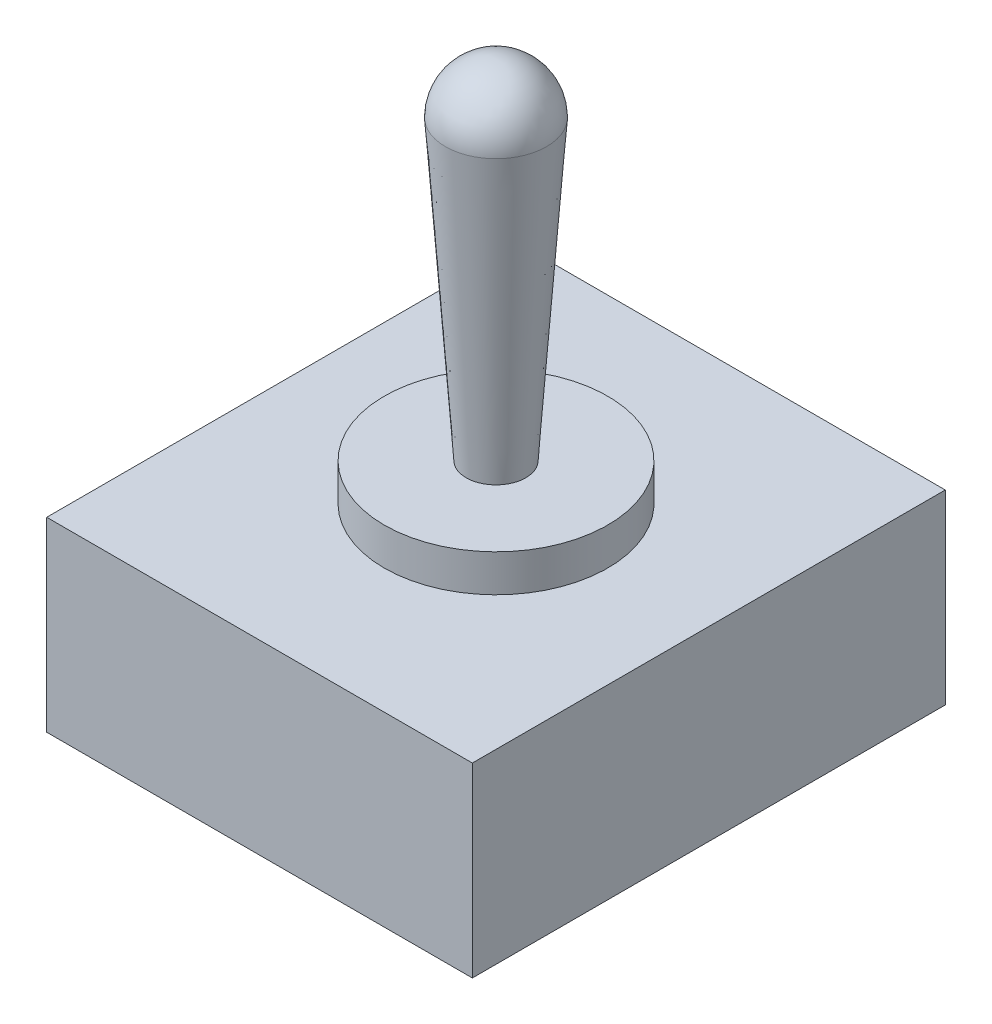
ISO-10303-21;
HEADER;
FILE_DESCRIPTION(('STEP AP214'),'2;1');
FILE_NAME('part.step','',(''),(''),'','','');
FILE_SCHEMA(('AUTOMOTIVE_DESIGN { 1 0 10303 214 1 1 1 1 }'));
ENDSEC;
DATA;
#1=APPLICATION_CONTEXT('core data for automotive mechanical design processes');
#2=APPLICATION_PROTOCOL_DEFINITION('international standard','automotive_design',2000,#1);
#3=PRODUCT_CONTEXT('',#1,'mechanical');
#4=PRODUCT('Part','Part','',(#3));
#5=PRODUCT_RELATED_PRODUCT_CATEGORY('part','',(#4));
#6=PRODUCT_DEFINITION_FORMATION('','',#4);
#7=PRODUCT_DEFINITION_CONTEXT('part definition',#1,'design');
#8=PRODUCT_DEFINITION('design','',#6,#7);
#9=PRODUCT_DEFINITION_SHAPE('','',#8);
#10=(LENGTH_UNIT() NAMED_UNIT(*) SI_UNIT(.MILLI.,.METRE.));
#11=(NAMED_UNIT(*) PLANE_ANGLE_UNIT() SI_UNIT($,.RADIAN.));
#12=(NAMED_UNIT(*) SI_UNIT($,.STERADIAN.) SOLID_ANGLE_UNIT());
#13=UNCERTAINTY_MEASURE_WITH_UNIT(LENGTH_MEASURE(1.E-05),#10,'distance_accuracy_value','');
#14=(GEOMETRIC_REPRESENTATION_CONTEXT(3) GLOBAL_UNCERTAINTY_ASSIGNED_CONTEXT((#13)) GLOBAL_UNIT_ASSIGNED_CONTEXT((#10,
#11,#12)) REPRESENTATION_CONTEXT('',''));
#15=CARTESIAN_POINT('',(0.,0.,0.));
#16=DIRECTION('',(0.,0.,1.));
#17=DIRECTION('',(1.,0.,0.));
#18=AXIS2_PLACEMENT_3D('',#15,#16,#17);
#19=CARTESIAN_POINT('',(5.715,13.9805124020786,-6.35));
#20=DIRECTION('',(0.,-1.,0.));
#21=DIRECTION('',(0.,0.,1.));
#22=AXIS2_PLACEMENT_3D('',#19,#20,#21);
#23=SPHERICAL_SURFACE('',#22,1.35805178995303);
#24=CARTESIAN_POINT('',(5.715,13.9805124020786,-6.35));
#25=DIRECTION('',(0.,-1.,0.));
#26=DIRECTION('',(0.,0.,-1.));
#27=AXIS2_PLACEMENT_3D('',#24,#25,#26);
#28=CIRCLE('',#27,1.35805178995303);
#29=CARTESIAN_POINT('',(5.715,13.9805124020786,-7.70805178995303));
#30=VERTEX_POINT('',#29);
#31=EDGE_CURVE('E11',#30,#30,#28,.T.);
#32=ORIENTED_EDGE('',*,*,#31,.F.);
#33=EDGE_LOOP('',(#32));
#34=FACE_BOUND('',#33,.T.);
#35=ADVANCED_FACE('F49',(#34),#23,.T.);
#36=CARTESIAN_POINT('',(5.715,6.,-6.35));
#37=DIRECTION('',(0.,1.,0.));
#38=DIRECTION('',(0.,0.,1.));
#39=AXIS2_PLACEMENT_3D('',#36,#37,#38);
#40=CONICAL_SURFACE('',#39,0.800000000000001,0.0698131700797767);
#41=ORIENTED_EDGE('',*,*,#31,.T.);
#42=EDGE_LOOP('',(#41));
#43=FACE_BOUND('',#42,.T.);
#44=CARTESIAN_POINT('',(5.715,6.,-6.35));
#45=DIRECTION('',(0.,-1.,0.));
#46=DIRECTION('',(0.,0.,-1.));
#47=AXIS2_PLACEMENT_3D('',#44,#45,#46);
#48=CIRCLE('',#47,0.800000000000001);
#49=CARTESIAN_POINT('',(5.715,6.,-7.15));
#50=VERTEX_POINT('',#49);
#51=EDGE_CURVE('E55',#50,#50,#48,.T.);
#52=ORIENTED_EDGE('',*,*,#51,.F.);
#53=EDGE_LOOP('',(#52));
#54=FACE_BOUND('',#53,.T.);
#55=ADVANCED_FACE('F63',(#43,#54),#40,.T.);
#56=CARTESIAN_POINT('',(5.715,6.,-6.35));
#57=DIRECTION('',(0.,-1.,0.));
#58=DIRECTION('',(0.,0.,1.));
#59=AXIS2_PLACEMENT_3D('',#56,#57,#58);
#60=SPHERICAL_SURFACE('',#59,0.800000000000001);
#61=ORIENTED_EDGE('',*,*,#51,.T.);
#62=EDGE_LOOP('',(#61));
#63=FACE_BOUND('',#62,.T.);
#64=ADVANCED_FACE('F61',(#63),#60,.F.);
#65=CLOSED_SHELL('',(#35,#55,#64));
#66=MANIFOLD_SOLID_BREP('B2',#65);
#67=CARTESIAN_POINT('',(0.,5.,0.));
#68=DIRECTION('',(1.,0.,0.));
#69=DIRECTION('',(0.,0.,-1.));
#70=AXIS2_PLACEMENT_3D('',#67,#68,#69);
#71=PLANE('',#70);
#72=DIRECTION('',(0.,0.,1.));
#73=VECTOR('',#72,1.);
#74=CARTESIAN_POINT('',(0.,0.,0.));
#75=LINE('',#74,#73);
#76=CARTESIAN_POINT('',(0.,0.,-12.7));
#77=VERTEX_POINT('',#76);
#78=CARTESIAN_POINT('',(0.,0.,0.));
#79=VERTEX_POINT('',#78);
#80=EDGE_CURVE('E160',#77,#79,#75,.T.);
#81=ORIENTED_EDGE('',*,*,#80,.T.);
#82=DIRECTION('',(0.,-1.,0.));
#83=VECTOR('',#82,1.);
#84=CARTESIAN_POINT('',(0.,5.,0.));
#85=LINE('',#84,#83);
#86=CARTESIAN_POINT('',(0.,5.,0.));
#87=VERTEX_POINT('',#86);
#88=EDGE_CURVE('E97',#87,#79,#85,.T.);
#89=ORIENTED_EDGE('',*,*,#88,.F.);
#90=DIRECTION('',(0.,0.,1.));
#91=VECTOR('',#90,1.);
#92=CARTESIAN_POINT('',(0.,5.,0.));
#93=LINE('',#92,#91);
#94=CARTESIAN_POINT('',(0.,5.,-12.7));
#95=VERTEX_POINT('',#94);
#96=EDGE_CURVE('E147',#95,#87,#93,.T.);
#97=ORIENTED_EDGE('',*,*,#96,.F.);
#98=DIRECTION('',(0.,-1.,0.));
#99=VECTOR('',#98,1.);
#100=CARTESIAN_POINT('',(0.,5.,-12.7));
#101=LINE('',#100,#99);
#102=EDGE_CURVE('E156',#95,#77,#101,.T.);
#103=ORIENTED_EDGE('',*,*,#102,.T.);
#104=EDGE_LOOP('',(#81,#89,#97,#103));
#105=FACE_BOUND('',#104,.T.);
#106=ADVANCED_FACE('F94',(#105),#71,.F.);
#107=CARTESIAN_POINT('',(0.,5.,0.));
#108=DIRECTION('',(0.,0.,-1.));
#109=DIRECTION('',(-1.,0.,0.));
#110=AXIS2_PLACEMENT_3D('',#107,#108,#109);
#111=PLANE('',#110);
#112=DIRECTION('',(1.,0.,0.));
#113=VECTOR('',#112,1.);
#114=CARTESIAN_POINT('',(0.,0.,0.));
#115=LINE('',#114,#113);
#116=CARTESIAN_POINT('',(11.43,0.,0.));
#117=VERTEX_POINT('',#116);
#118=EDGE_CURVE('E152',#79,#117,#115,.T.);
#119=ORIENTED_EDGE('',*,*,#118,.T.);
#120=DIRECTION('',(0.,-1.,0.));
#121=VECTOR('',#120,1.);
#122=CARTESIAN_POINT('',(11.43,5.,0.));
#123=LINE('',#122,#121);
#124=CARTESIAN_POINT('',(11.43,5.,0.));
#125=VERTEX_POINT('',#124);
#126=EDGE_CURVE('E150',#125,#117,#123,.T.);
#127=ORIENTED_EDGE('',*,*,#126,.F.);
#128=DIRECTION('',(1.,0.,0.));
#129=VECTOR('',#128,1.);
#130=CARTESIAN_POINT('',(0.,5.,0.));
#131=LINE('',#130,#129);
#132=EDGE_CURVE('E142',#87,#125,#131,.T.);
#133=ORIENTED_EDGE('',*,*,#132,.F.);
#134=ORIENTED_EDGE('',*,*,#88,.T.);
#135=EDGE_LOOP('',(#119,#127,#133,#134));
#136=FACE_BOUND('',#135,.T.);
#137=ADVANCED_FACE('F151',(#136),#111,.F.);
#138=CARTESIAN_POINT('',(11.43,5.,0.));
#139=DIRECTION('',(-1.,0.,0.));
#140=DIRECTION('',(0.,0.,1.));
#141=AXIS2_PLACEMENT_3D('',#138,#139,#140);
#142=PLANE('',#141);
#143=DIRECTION('',(0.,0.,-1.));
#144=VECTOR('',#143,1.);
#145=CARTESIAN_POINT('',(11.43,0.,0.));
#146=LINE('',#145,#144);
#147=CARTESIAN_POINT('',(11.43,0.,-12.7));
#148=VERTEX_POINT('',#147);
#149=EDGE_CURVE('E128',#117,#148,#146,.T.);
#150=ORIENTED_EDGE('',*,*,#149,.T.);
#151=DIRECTION('',(0.,-1.,0.));
#152=VECTOR('',#151,1.);
#153=CARTESIAN_POINT('',(11.43,5.,-12.7));
#154=LINE('',#153,#152);
#155=CARTESIAN_POINT('',(11.43,5.,-12.7));
#156=VERTEX_POINT('',#155);
#157=EDGE_CURVE('E153',#156,#148,#154,.T.);
#158=ORIENTED_EDGE('',*,*,#157,.F.);
#159=DIRECTION('',(0.,0.,-1.));
#160=VECTOR('',#159,1.);
#161=CARTESIAN_POINT('',(11.43,5.,0.));
#162=LINE('',#161,#160);
#163=EDGE_CURVE('E145',#125,#156,#162,.T.);
#164=ORIENTED_EDGE('',*,*,#163,.F.);
#165=ORIENTED_EDGE('',*,*,#126,.T.);
#166=EDGE_LOOP('',(#150,#158,#164,#165));
#167=FACE_BOUND('',#166,.T.);
#168=ADVANCED_FACE('F154',(#167),#142,.F.);
#169=CARTESIAN_POINT('',(0.,5.,-12.7));
#170=DIRECTION('',(0.,0.,1.));
#171=DIRECTION('',(1.,0.,0.));
#172=AXIS2_PLACEMENT_3D('',#169,#170,#171);
#173=PLANE('',#172);
#174=DIRECTION('',(-1.,0.,0.));
#175=VECTOR('',#174,1.);
#176=CARTESIAN_POINT('',(0.,0.,-12.7));
#177=LINE('',#176,#175);
#178=EDGE_CURVE('E134',#148,#77,#177,.T.);
#179=ORIENTED_EDGE('',*,*,#178,.T.);
#180=ORIENTED_EDGE('',*,*,#102,.F.);
#181=DIRECTION('',(-1.,0.,0.));
#182=VECTOR('',#181,1.);
#183=CARTESIAN_POINT('',(0.,5.,-12.7));
#184=LINE('',#183,#182);
#185=EDGE_CURVE('E111',#156,#95,#184,.T.);
#186=ORIENTED_EDGE('',*,*,#185,.F.);
#187=ORIENTED_EDGE('',*,*,#157,.T.);
#188=EDGE_LOOP('',(#179,#180,#186,#187));
#189=FACE_BOUND('',#188,.T.);
#190=ADVANCED_FACE('F168',(#189),#173,.F.);
#191=CARTESIAN_POINT('',(0.,5.,0.));
#192=DIRECTION('',(0.,-1.,0.));
#193=DIRECTION('',(0.,0.,-1.));
#194=AXIS2_PLACEMENT_3D('',#191,#192,#193);
#195=PLANE('',#194);
#196=CARTESIAN_POINT('',(5.715,5.,-6.35));
#197=DIRECTION('',(0.,1.,0.));
#198=DIRECTION('',(0.,0.,1.));
#199=AXIS2_PLACEMENT_3D('',#196,#197,#198);
#200=CIRCLE('',#199,3.);
#201=CARTESIAN_POINT('',(5.715,5.,-3.35));
#202=VERTEX_POINT('',#201);
#203=EDGE_CURVE('E47',#202,#202,#200,.T.);
#204=ORIENTED_EDGE('',*,*,#203,.F.);
#205=EDGE_LOOP('',(#204));
#206=FACE_BOUND('',#205,.T.);
#207=ORIENTED_EDGE('',*,*,#96,.T.);
#208=ORIENTED_EDGE('',*,*,#132,.T.);
#209=ORIENTED_EDGE('',*,*,#163,.T.);
#210=ORIENTED_EDGE('',*,*,#185,.T.);
#211=EDGE_LOOP('',(#207,#208,#209,#210));
#212=FACE_BOUND('',#211,.T.);
#213=ADVANCED_FACE('F143',(#206,#212),#195,.F.);
#214=CARTESIAN_POINT('',(0.,0.,0.));
#215=DIRECTION('',(0.,-1.,0.));
#216=DIRECTION('',(0.,0.,-1.));
#217=AXIS2_PLACEMENT_3D('',#214,#215,#216);
#218=PLANE('',#217);
#219=ORIENTED_EDGE('',*,*,#80,.F.);
#220=ORIENTED_EDGE('',*,*,#178,.F.);
#221=ORIENTED_EDGE('',*,*,#149,.F.);
#222=ORIENTED_EDGE('',*,*,#118,.F.);
#223=EDGE_LOOP('',(#219,#220,#221,#222));
#224=FACE_BOUND('',#223,.T.);
#225=ADVANCED_FACE('F171',(#224),#218,.T.);
#226=CARTESIAN_POINT('',(5.715,6.,-6.35));
#227=DIRECTION('',(0.,-1.,0.));
#228=DIRECTION('',(0.,0.,-1.));
#229=AXIS2_PLACEMENT_3D('',#226,#227,#228);
#230=CYLINDRICAL_SURFACE('',#229,3.);
#231=CARTESIAN_POINT('',(5.715,6.,-6.35));
#232=DIRECTION('',(0.,1.,0.));
#233=DIRECTION('',(0.,0.,1.));
#234=AXIS2_PLACEMENT_3D('',#231,#232,#233);
#235=CIRCLE('',#234,3.);
#236=CARTESIAN_POINT('',(5.715,6.,-3.35));
#237=VERTEX_POINT('',#236);
#238=EDGE_CURVE('E163',#237,#237,#235,.T.);
#239=ORIENTED_EDGE('',*,*,#238,.F.);
#240=EDGE_LOOP('',(#239));
#241=FACE_BOUND('',#240,.T.);
#242=ORIENTED_EDGE('',*,*,#203,.T.);
#243=EDGE_LOOP('',(#242));
#244=FACE_BOUND('',#243,.T.);
#245=ADVANCED_FACE('F179',(#241,#244),#230,.T.);
#246=CARTESIAN_POINT('',(0.,6.,0.));
#247=DIRECTION('',(0.,1.,0.));
#248=DIRECTION('',(0.,0.,1.));
#249=AXIS2_PLACEMENT_3D('',#246,#247,#248);
#250=PLANE('',#249);
#251=ORIENTED_EDGE('',*,*,#238,.T.);
#252=EDGE_LOOP('',(#251));
#253=FACE_BOUND('',#252,.T.);
#254=ADVANCED_FACE('F177',(#253),#250,.T.);
#255=CLOSED_SHELL('',(#106,#137,#168,#190,#213,#225,#245,#254));
#256=MANIFOLD_SOLID_BREP('B6',#255);
#257=ADVANCED_BREP_SHAPE_REPRESENTATION('',(#18,#66,#256),#14);
#258=SHAPE_DEFINITION_REPRESENTATION(#9,#257);
ENDSEC;
END-ISO-10303-21;
